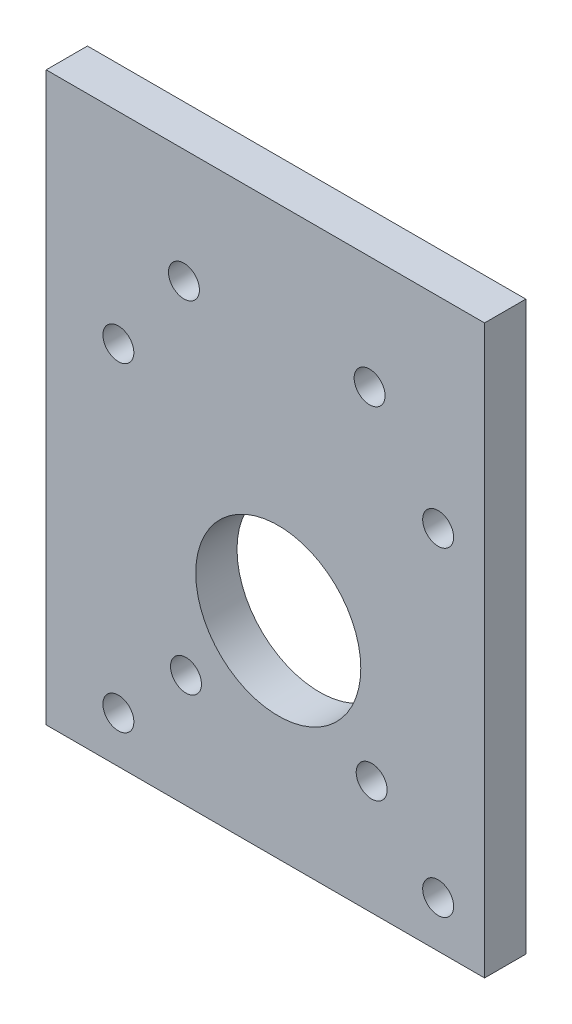
ISO-10303-21;
HEADER;
FILE_DESCRIPTION(('STEP AP214'),'2;1');
FILE_NAME('part.step','',(''),(''),'','','');
FILE_SCHEMA(('AUTOMOTIVE_DESIGN { 1 0 10303 214 1 1 1 1 }'));
ENDSEC;
DATA;
#1=APPLICATION_CONTEXT('core data for automotive mechanical design processes');
#2=APPLICATION_PROTOCOL_DEFINITION('international standard','automotive_design',2000,#1);
#3=PRODUCT_CONTEXT('',#1,'mechanical');
#4=PRODUCT('Part','Part','',(#3));
#5=PRODUCT_RELATED_PRODUCT_CATEGORY('part','',(#4));
#6=PRODUCT_DEFINITION_FORMATION('','',#4);
#7=PRODUCT_DEFINITION_CONTEXT('part definition',#1,'design');
#8=PRODUCT_DEFINITION('design','',#6,#7);
#9=PRODUCT_DEFINITION_SHAPE('','',#8);
#10=(LENGTH_UNIT() NAMED_UNIT(*) SI_UNIT(.MILLI.,.METRE.));
#11=(NAMED_UNIT(*) PLANE_ANGLE_UNIT() SI_UNIT($,.RADIAN.));
#12=(NAMED_UNIT(*) SI_UNIT($,.STERADIAN.) SOLID_ANGLE_UNIT());
#13=UNCERTAINTY_MEASURE_WITH_UNIT(LENGTH_MEASURE(1.E-05),#10,'distance_accuracy_value','');
#14=(GEOMETRIC_REPRESENTATION_CONTEXT(3) GLOBAL_UNCERTAINTY_ASSIGNED_CONTEXT((#13)) GLOBAL_UNIT_ASSIGNED_CONTEXT((#10,
#11,#12)) REPRESENTATION_CONTEXT('',''));
#15=CARTESIAN_POINT('',(0.,0.,0.));
#16=DIRECTION('',(0.,0.,1.));
#17=DIRECTION('',(1.,0.,0.));
#18=AXIS2_PLACEMENT_3D('',#15,#16,#17);
#19=CARTESIAN_POINT('',(21.25,20.,-2.));
#20=DIRECTION('',(-1.,0.,0.));
#21=DIRECTION('',(0.,0.,-1.));
#22=AXIS2_PLACEMENT_3D('',#19,#20,#21);
#23=PLANE('',#22);
#24=DIRECTION('',(0.,1.,0.));
#25=VECTOR('',#24,1.);
#26=CARTESIAN_POINT('',(21.25,20.,2.));
#27=LINE('',#26,#25);
#28=CARTESIAN_POINT('',(21.25,-20.,2.));
#29=VERTEX_POINT('',#28);
#30=CARTESIAN_POINT('',(21.25,35.,2.));
#31=VERTEX_POINT('',#30);
#32=EDGE_CURVE('E137',#29,#31,#27,.T.);
#33=ORIENTED_EDGE('',*,*,#32,.F.);
#34=DIRECTION('',(0.,0.,1.));
#35=VECTOR('',#34,1.);
#36=CARTESIAN_POINT('',(21.25,-20.,-2.));
#37=LINE('',#36,#35);
#38=CARTESIAN_POINT('',(21.25,-20.,-2.));
#39=VERTEX_POINT('',#38);
#40=EDGE_CURVE('E46',#39,#29,#37,.T.);
#41=ORIENTED_EDGE('',*,*,#40,.F.);
#42=DIRECTION('',(0.,1.,0.));
#43=VECTOR('',#42,1.);
#44=CARTESIAN_POINT('',(21.25,20.,-2.));
#45=LINE('',#44,#43);
#46=CARTESIAN_POINT('',(21.25,35.,-2.));
#47=VERTEX_POINT('',#46);
#48=EDGE_CURVE('E96',#39,#47,#45,.T.);
#49=ORIENTED_EDGE('',*,*,#48,.T.);
#50=DIRECTION('',(0.,0.,1.));
#51=VECTOR('',#50,1.);
#52=CARTESIAN_POINT('',(21.25,35.,2.));
#53=LINE('',#52,#51);
#54=EDGE_CURVE('E88',#47,#31,#53,.T.);
#55=ORIENTED_EDGE('',*,*,#54,.T.);
#56=EDGE_LOOP('',(#33,#41,#49,#55));
#57=FACE_BOUND('',#56,.T.);
#58=ADVANCED_FACE('F37',(#57),#23,.F.);
#59=CARTESIAN_POINT('',(-21.25,20.,-2.));
#60=DIRECTION('',(1.,0.,0.));
#61=DIRECTION('',(0.,1.,0.));
#62=AXIS2_PLACEMENT_3D('',#59,#60,#61);
#63=PLANE('',#62);
#64=DIRECTION('',(0.,-1.,0.));
#65=VECTOR('',#64,1.);
#66=CARTESIAN_POINT('',(-21.25,20.,2.));
#67=LINE('',#66,#65);
#68=CARTESIAN_POINT('',(-21.25,35.,2.));
#69=VERTEX_POINT('',#68);
#70=CARTESIAN_POINT('',(-21.25,-20.,2.));
#71=VERTEX_POINT('',#70);
#72=EDGE_CURVE('E99',#69,#71,#67,.T.);
#73=ORIENTED_EDGE('',*,*,#72,.F.);
#74=DIRECTION('',(0.,0.,-1.));
#75=VECTOR('',#74,1.);
#76=CARTESIAN_POINT('',(-21.25,35.,2.));
#77=LINE('',#76,#75);
#78=CARTESIAN_POINT('',(-21.25,35.,-2.));
#79=VERTEX_POINT('',#78);
#80=EDGE_CURVE('E85',#69,#79,#77,.T.);
#81=ORIENTED_EDGE('',*,*,#80,.T.);
#82=DIRECTION('',(0.,-1.,0.));
#83=VECTOR('',#82,1.);
#84=CARTESIAN_POINT('',(-21.25,20.,-2.));
#85=LINE('',#84,#83);
#86=CARTESIAN_POINT('',(-21.25,-20.,-2.));
#87=VERTEX_POINT('',#86);
#88=EDGE_CURVE('E93',#79,#87,#85,.T.);
#89=ORIENTED_EDGE('',*,*,#88,.T.);
#90=DIRECTION('',(0.,0.,1.));
#91=VECTOR('',#90,1.);
#92=CARTESIAN_POINT('',(-21.25,-20.,-2.));
#93=LINE('',#92,#91);
#94=EDGE_CURVE('E11',#87,#71,#93,.T.);
#95=ORIENTED_EDGE('',*,*,#94,.T.);
#96=EDGE_LOOP('',(#73,#81,#89,#95));
#97=FACE_BOUND('',#96,.T.);
#98=ADVANCED_FACE('F98',(#97),#63,.F.);
#99=CARTESIAN_POINT('',(-21.25,-20.,-2.));
#100=DIRECTION('',(0.,1.,0.));
#101=DIRECTION('',(0.,0.,-1.));
#102=AXIS2_PLACEMENT_3D('',#99,#100,#101);
#103=PLANE('',#102);
#104=DIRECTION('',(1.,0.,0.));
#105=VECTOR('',#104,1.);
#106=CARTESIAN_POINT('',(-21.25,-20.,2.));
#107=LINE('',#106,#105);
#108=EDGE_CURVE('E63',#71,#29,#107,.T.);
#109=ORIENTED_EDGE('',*,*,#108,.F.);
#110=ORIENTED_EDGE('',*,*,#94,.F.);
#111=DIRECTION('',(1.,0.,0.));
#112=VECTOR('',#111,1.);
#113=CARTESIAN_POINT('',(-21.25,-20.,-2.));
#114=LINE('',#113,#112);
#115=EDGE_CURVE('E55',#87,#39,#114,.T.);
#116=ORIENTED_EDGE('',*,*,#115,.T.);
#117=ORIENTED_EDGE('',*,*,#40,.T.);
#118=EDGE_LOOP('',(#109,#110,#116,#117));
#119=FACE_BOUND('',#118,.T.);
#120=ADVANCED_FACE('F178',(#119),#103,.F.);
#121=CARTESIAN_POINT('',(0.,0.,-2.));
#122=DIRECTION('',(0.,0.,-1.));
#123=DIRECTION('',(1.,0.,0.));
#124=AXIS2_PLACEMENT_3D('',#121,#122,#123);
#125=PLANE('',#124);
#126=CARTESIAN_POINT('',(-7.69577181131252,-9.05390339576949,-2.));
#127=DIRECTION('',(0.,0.,1.));
#128=DIRECTION('',(1.,0.,0.));
#129=AXIS2_PLACEMENT_3D('',#126,#127,#128);
#130=CIRCLE('',#129,1.5);
#131=CARTESIAN_POINT('',(-6.19577181131252,-9.05390339576949,-2.));
#132=VERTEX_POINT('',#131);
#133=EDGE_CURVE('E316',#132,#132,#130,.T.);
#134=ORIENTED_EDGE('',*,*,#133,.T.);
#135=EDGE_LOOP('',(#134));
#136=FACE_BOUND('',#135,.T.);
#137=CARTESIAN_POINT('',(10.3039033957695,-8.94577181131251,-2.));
#138=DIRECTION('',(0.,0.,1.));
#139=DIRECTION('',(1.,0.,0.));
#140=AXIS2_PLACEMENT_3D('',#137,#138,#139);
#141=CIRCLE('',#140,1.5);
#142=CARTESIAN_POINT('',(11.8039033957695,-8.94577181131251,-2.));
#143=VERTEX_POINT('',#142);
#144=EDGE_CURVE('E318',#143,#143,#141,.T.);
#145=ORIENTED_EDGE('',*,*,#144,.T.);
#146=EDGE_LOOP('',(#145));
#147=FACE_BOUND('',#146,.T.);
#148=CARTESIAN_POINT('',(10.1056621575984,24.0536327350045,-2.));
#149=DIRECTION('',(0.,0.,1.));
#150=DIRECTION('',(1.,0.,0.));
#151=AXIS2_PLACEMENT_3D('',#148,#149,#150);
#152=CIRCLE('',#151,1.5);
#153=CARTESIAN_POINT('',(11.6056621575984,24.0536327350045,-2.));
#154=VERTEX_POINT('',#153);
#155=EDGE_CURVE('E320',#154,#154,#152,.T.);
#156=ORIENTED_EDGE('',*,*,#155,.T.);
#157=EDGE_LOOP('',(#156));
#158=FACE_BOUND('',#157,.T.);
#159=CARTESIAN_POINT('',(-7.89401304948366,23.9455011505475,-2.));
#160=DIRECTION('',(0.,0.,1.));
#161=DIRECTION('',(1.,0.,0.));
#162=AXIS2_PLACEMENT_3D('',#159,#160,#161);
#163=CIRCLE('',#162,1.5);
#164=CARTESIAN_POINT('',(-6.39401304948366,23.9455011505475,-2.));
#165=VERTEX_POINT('',#164);
#166=EDGE_CURVE('E104',#165,#165,#163,.T.);
#167=ORIENTED_EDGE('',*,*,#166,.T.);
#168=EDGE_LOOP('',(#167));
#169=FACE_BOUND('',#168,.T.);
#170=CARTESIAN_POINT('',(1.25,0.,-2.));
#171=DIRECTION('',(0.,0.,1.));
#172=DIRECTION('',(1.,0.,0.));
#173=AXIS2_PLACEMENT_3D('',#170,#171,#172);
#174=CIRCLE('',#173,8.);
#175=CARTESIAN_POINT('',(9.25,0.,-2.));
#176=VERTEX_POINT('',#175);
#177=EDGE_CURVE('E109',#176,#176,#174,.T.);
#178=ORIENTED_EDGE('',*,*,#177,.T.);
#179=EDGE_LOOP('',(#178));
#180=FACE_BOUND('',#179,.T.);
#181=CARTESIAN_POINT('',(16.75,-15.5,-2.));
#182=DIRECTION('',(0.,0.,-1.));
#183=DIRECTION('',(-1.,0.,0.));
#184=AXIS2_PLACEMENT_3D('',#181,#182,#183);
#185=CIRCLE('',#184,1.5);
#186=CARTESIAN_POINT('',(15.25,-15.5,-2.));
#187=VERTEX_POINT('',#186);
#188=EDGE_CURVE('E129',#187,#187,#185,.T.);
#189=ORIENTED_EDGE('',*,*,#188,.F.);
#190=EDGE_LOOP('',(#189));
#191=FACE_BOUND('',#190,.T.);
#192=CARTESIAN_POINT('',(-14.25,-15.5,-2.));
#193=DIRECTION('',(0.,0.,-1.));
#194=DIRECTION('',(-1.,0.,0.));
#195=AXIS2_PLACEMENT_3D('',#192,#193,#194);
#196=CIRCLE('',#195,1.5);
#197=CARTESIAN_POINT('',(-15.75,-15.5,-2.));
#198=VERTEX_POINT('',#197);
#199=EDGE_CURVE('E123',#198,#198,#196,.T.);
#200=ORIENTED_EDGE('',*,*,#199,.F.);
#201=EDGE_LOOP('',(#200));
#202=FACE_BOUND('',#201,.T.);
#203=CARTESIAN_POINT('',(-14.25,15.5,-2.));
#204=DIRECTION('',(0.,0.,-1.));
#205=DIRECTION('',(-1.,0.,0.));
#206=AXIS2_PLACEMENT_3D('',#203,#204,#205);
#207=CIRCLE('',#206,1.5);
#208=CARTESIAN_POINT('',(-15.75,15.5,-2.));
#209=VERTEX_POINT('',#208);
#210=EDGE_CURVE('E116',#209,#209,#207,.T.);
#211=ORIENTED_EDGE('',*,*,#210,.F.);
#212=EDGE_LOOP('',(#211));
#213=FACE_BOUND('',#212,.T.);
#214=CARTESIAN_POINT('',(16.75,15.5,-2.));
#215=DIRECTION('',(0.,0.,-1.));
#216=DIRECTION('',(-1.,0.,0.));
#217=AXIS2_PLACEMENT_3D('',#214,#215,#216);
#218=CIRCLE('',#217,1.5);
#219=CARTESIAN_POINT('',(15.25,15.5,-2.));
#220=VERTEX_POINT('',#219);
#221=EDGE_CURVE('E134',#220,#220,#218,.T.);
#222=ORIENTED_EDGE('',*,*,#221,.F.);
#223=EDGE_LOOP('',(#222));
#224=FACE_BOUND('',#223,.T.);
#225=ORIENTED_EDGE('',*,*,#48,.F.);
#226=ORIENTED_EDGE('',*,*,#115,.F.);
#227=ORIENTED_EDGE('',*,*,#88,.F.);
#228=DIRECTION('',(1.,0.,0.));
#229=VECTOR('',#228,1.);
#230=CARTESIAN_POINT('',(-21.25,35.,-2.));
#231=LINE('',#230,#229);
#232=EDGE_CURVE('E81',#79,#47,#231,.T.);
#233=ORIENTED_EDGE('',*,*,#232,.T.);
#234=EDGE_LOOP('',(#225,#226,#227,#233));
#235=FACE_BOUND('',#234,.T.);
#236=ADVANCED_FACE('F94',(#136,#147,#158,#169,#180,#191,#202,#213,#224,#235),#125,.T.);
#237=CARTESIAN_POINT('',(0.,0.,2.));
#238=DIRECTION('',(0.,0.,-1.));
#239=DIRECTION('',(1.,0.,0.));
#240=AXIS2_PLACEMENT_3D('',#237,#238,#239);
#241=PLANE('',#240);
#242=CARTESIAN_POINT('',(-7.69577181131252,-9.05390339576949,2.));
#243=DIRECTION('',(0.,0.,1.));
#244=DIRECTION('',(1.,0.,0.));
#245=AXIS2_PLACEMENT_3D('',#242,#243,#244);
#246=CIRCLE('',#245,1.5);
#247=CARTESIAN_POINT('',(-6.19577181131252,-9.05390339576949,2.));
#248=VERTEX_POINT('',#247);
#249=EDGE_CURVE('E40',#248,#248,#246,.T.);
#250=ORIENTED_EDGE('',*,*,#249,.F.);
#251=EDGE_LOOP('',(#250));
#252=FACE_BOUND('',#251,.T.);
#253=CARTESIAN_POINT('',(10.3039033957695,-8.94577181131251,2.));
#254=DIRECTION('',(0.,0.,1.));
#255=DIRECTION('',(1.,0.,0.));
#256=AXIS2_PLACEMENT_3D('',#253,#254,#255);
#257=CIRCLE('',#256,1.5);
#258=CARTESIAN_POINT('',(11.8039033957695,-8.94577181131251,2.));
#259=VERTEX_POINT('',#258);
#260=EDGE_CURVE('E102',#259,#259,#257,.T.);
#261=ORIENTED_EDGE('',*,*,#260,.F.);
#262=EDGE_LOOP('',(#261));
#263=FACE_BOUND('',#262,.T.);
#264=CARTESIAN_POINT('',(10.1056621575984,24.0536327350045,2.));
#265=DIRECTION('',(0.,0.,1.));
#266=DIRECTION('',(1.,0.,0.));
#267=AXIS2_PLACEMENT_3D('',#264,#265,#266);
#268=CIRCLE('',#267,1.5);
#269=CARTESIAN_POINT('',(11.6056621575984,24.0536327350045,2.));
#270=VERTEX_POINT('',#269);
#271=EDGE_CURVE('E149',#270,#270,#268,.T.);
#272=ORIENTED_EDGE('',*,*,#271,.F.);
#273=EDGE_LOOP('',(#272));
#274=FACE_BOUND('',#273,.T.);
#275=CARTESIAN_POINT('',(-7.89401304948366,23.9455011505475,2.));
#276=DIRECTION('',(0.,0.,1.));
#277=DIRECTION('',(1.,0.,0.));
#278=AXIS2_PLACEMENT_3D('',#275,#276,#277);
#279=CIRCLE('',#278,1.5);
#280=CARTESIAN_POINT('',(-6.39401304948366,23.9455011505475,2.));
#281=VERTEX_POINT('',#280);
#282=EDGE_CURVE('E146',#281,#281,#279,.T.);
#283=ORIENTED_EDGE('',*,*,#282,.F.);
#284=EDGE_LOOP('',(#283));
#285=FACE_BOUND('',#284,.T.);
#286=CARTESIAN_POINT('',(1.25,0.,2.));
#287=DIRECTION('',(0.,0.,1.));
#288=DIRECTION('',(1.,0.,0.));
#289=AXIS2_PLACEMENT_3D('',#286,#287,#288);
#290=CIRCLE('',#289,8.);
#291=CARTESIAN_POINT('',(9.25,0.,2.));
#292=VERTEX_POINT('',#291);
#293=EDGE_CURVE('E110',#292,#292,#290,.T.);
#294=ORIENTED_EDGE('',*,*,#293,.F.);
#295=EDGE_LOOP('',(#294));
#296=FACE_BOUND('',#295,.T.);
#297=CARTESIAN_POINT('',(16.75,-15.5,2.));
#298=DIRECTION('',(0.,0.,-1.));
#299=DIRECTION('',(-1.,0.,0.));
#300=AXIS2_PLACEMENT_3D('',#297,#298,#299);
#301=CIRCLE('',#300,1.5);
#302=CARTESIAN_POINT('',(15.25,-15.5,2.));
#303=VERTEX_POINT('',#302);
#304=EDGE_CURVE('E113',#303,#303,#301,.T.);
#305=ORIENTED_EDGE('',*,*,#304,.T.);
#306=EDGE_LOOP('',(#305));
#307=FACE_BOUND('',#306,.T.);
#308=CARTESIAN_POINT('',(-14.25,-15.5,2.));
#309=DIRECTION('',(0.,0.,-1.));
#310=DIRECTION('',(-1.,0.,0.));
#311=AXIS2_PLACEMENT_3D('',#308,#309,#310);
#312=CIRCLE('',#311,1.5);
#313=CARTESIAN_POINT('',(-15.75,-15.5,2.));
#314=VERTEX_POINT('',#313);
#315=EDGE_CURVE('E126',#314,#314,#312,.T.);
#316=ORIENTED_EDGE('',*,*,#315,.T.);
#317=EDGE_LOOP('',(#316));
#318=FACE_BOUND('',#317,.T.);
#319=CARTESIAN_POINT('',(-14.25,15.5,2.));
#320=DIRECTION('',(0.,0.,-1.));
#321=DIRECTION('',(-1.,0.,0.));
#322=AXIS2_PLACEMENT_3D('',#319,#320,#321);
#323=CIRCLE('',#322,1.5);
#324=CARTESIAN_POINT('',(-15.75,15.5,2.));
#325=VERTEX_POINT('',#324);
#326=EDGE_CURVE('E120',#325,#325,#323,.T.);
#327=ORIENTED_EDGE('',*,*,#326,.T.);
#328=EDGE_LOOP('',(#327));
#329=FACE_BOUND('',#328,.T.);
#330=CARTESIAN_POINT('',(16.75,15.5,2.));
#331=DIRECTION('',(0.,0.,-1.));
#332=DIRECTION('',(-1.,0.,0.));
#333=AXIS2_PLACEMENT_3D('',#330,#331,#332);
#334=CIRCLE('',#333,1.5);
#335=CARTESIAN_POINT('',(15.25,15.5,2.));
#336=VERTEX_POINT('',#335);
#337=EDGE_CURVE('E119',#336,#336,#334,.T.);
#338=ORIENTED_EDGE('',*,*,#337,.T.);
#339=EDGE_LOOP('',(#338));
#340=FACE_BOUND('',#339,.T.);
#341=ORIENTED_EDGE('',*,*,#32,.T.);
#342=DIRECTION('',(-1.,0.,0.));
#343=VECTOR('',#342,1.);
#344=CARTESIAN_POINT('',(-21.25,35.,2.));
#345=LINE('',#344,#343);
#346=EDGE_CURVE('E70',#31,#69,#345,.T.);
#347=ORIENTED_EDGE('',*,*,#346,.T.);
#348=ORIENTED_EDGE('',*,*,#72,.T.);
#349=ORIENTED_EDGE('',*,*,#108,.T.);
#350=EDGE_LOOP('',(#341,#347,#348,#349));
#351=FACE_BOUND('',#350,.T.);
#352=ADVANCED_FACE('F156',(#252,#263,#274,#285,#296,#307,#318,#329,#340,#351),#241,.F.);
#353=CARTESIAN_POINT('',(16.75,15.5,-2.));
#354=DIRECTION('',(0.,0.,1.));
#355=DIRECTION('',(-1.,0.,0.));
#356=AXIS2_PLACEMENT_3D('',#353,#354,#355);
#357=CYLINDRICAL_SURFACE('',#356,1.5);
#358=ORIENTED_EDGE('',*,*,#221,.T.);
#359=EDGE_LOOP('',(#358));
#360=FACE_BOUND('',#359,.T.);
#361=ORIENTED_EDGE('',*,*,#337,.F.);
#362=EDGE_LOOP('',(#361));
#363=FACE_BOUND('',#362,.T.);
#364=ADVANCED_FACE('F159',(#360,#363),#357,.F.);
#365=CARTESIAN_POINT('',(-14.25,15.5,-2.));
#366=DIRECTION('',(0.,0.,1.));
#367=DIRECTION('',(-1.,0.,0.));
#368=AXIS2_PLACEMENT_3D('',#365,#366,#367);
#369=CYLINDRICAL_SURFACE('',#368,1.5);
#370=ORIENTED_EDGE('',*,*,#210,.T.);
#371=EDGE_LOOP('',(#370));
#372=FACE_BOUND('',#371,.T.);
#373=ORIENTED_EDGE('',*,*,#326,.F.);
#374=EDGE_LOOP('',(#373));
#375=FACE_BOUND('',#374,.T.);
#376=ADVANCED_FACE('F222',(#372,#375),#369,.F.);
#377=CARTESIAN_POINT('',(-14.25,-15.5,-2.));
#378=DIRECTION('',(0.,0.,1.));
#379=DIRECTION('',(-1.,0.,0.));
#380=AXIS2_PLACEMENT_3D('',#377,#378,#379);
#381=CYLINDRICAL_SURFACE('',#380,1.5);
#382=ORIENTED_EDGE('',*,*,#199,.T.);
#383=EDGE_LOOP('',(#382));
#384=FACE_BOUND('',#383,.T.);
#385=ORIENTED_EDGE('',*,*,#315,.F.);
#386=EDGE_LOOP('',(#385));
#387=FACE_BOUND('',#386,.T.);
#388=ADVANCED_FACE('F232',(#384,#387),#381,.F.);
#389=CARTESIAN_POINT('',(16.75,-15.5,-2.));
#390=DIRECTION('',(0.,0.,1.));
#391=DIRECTION('',(-1.,0.,0.));
#392=AXIS2_PLACEMENT_3D('',#389,#390,#391);
#393=CYLINDRICAL_SURFACE('',#392,1.5);
#394=ORIENTED_EDGE('',*,*,#188,.T.);
#395=EDGE_LOOP('',(#394));
#396=FACE_BOUND('',#395,.T.);
#397=ORIENTED_EDGE('',*,*,#304,.F.);
#398=EDGE_LOOP('',(#397));
#399=FACE_BOUND('',#398,.T.);
#400=ADVANCED_FACE('F242',(#396,#399),#393,.F.);
#401=CARTESIAN_POINT('',(1.25,0.,2.));
#402=DIRECTION('',(0.,0.,-1.));
#403=DIRECTION('',(1.,0.,0.));
#404=AXIS2_PLACEMENT_3D('',#401,#402,#403);
#405=CYLINDRICAL_SURFACE('',#404,8.);
#406=ORIENTED_EDGE('',*,*,#293,.T.);
#407=EDGE_LOOP('',(#406));
#408=FACE_BOUND('',#407,.T.);
#409=ORIENTED_EDGE('',*,*,#177,.F.);
#410=EDGE_LOOP('',(#409));
#411=FACE_BOUND('',#410,.T.);
#412=ADVANCED_FACE('F252',(#408,#411),#405,.F.);
#413=CARTESIAN_POINT('',(0.,35.,0.));
#414=DIRECTION('',(0.,1.,0.));
#415=DIRECTION('',(0.,0.,-1.));
#416=AXIS2_PLACEMENT_3D('',#413,#414,#415);
#417=PLANE('',#416);
#418=ORIENTED_EDGE('',*,*,#80,.F.);
#419=ORIENTED_EDGE('',*,*,#346,.F.);
#420=ORIENTED_EDGE('',*,*,#54,.F.);
#421=ORIENTED_EDGE('',*,*,#232,.F.);
#422=EDGE_LOOP('',(#418,#419,#420,#421));
#423=FACE_BOUND('',#422,.T.);
#424=ADVANCED_FACE('F83',(#423),#417,.T.);
#425=CARTESIAN_POINT('',(-7.89401304948366,23.9455011505475,8.));
#426=DIRECTION('',(0.,0.,-1.));
#427=DIRECTION('',(1.,0.,0.));
#428=AXIS2_PLACEMENT_3D('',#425,#426,#427);
#429=CYLINDRICAL_SURFACE('',#428,1.5);
#430=ORIENTED_EDGE('',*,*,#166,.F.);
#431=EDGE_LOOP('',(#430));
#432=FACE_BOUND('',#431,.T.);
#433=ORIENTED_EDGE('',*,*,#282,.T.);
#434=EDGE_LOOP('',(#433));
#435=FACE_BOUND('',#434,.T.);
#436=ADVANCED_FACE('F271',(#432,#435),#429,.F.);
#437=CARTESIAN_POINT('',(10.1056621575984,24.0536327350045,8.));
#438=DIRECTION('',(0.,0.,-1.));
#439=DIRECTION('',(1.,0.,0.));
#440=AXIS2_PLACEMENT_3D('',#437,#438,#439);
#441=CYLINDRICAL_SURFACE('',#440,1.5);
#442=ORIENTED_EDGE('',*,*,#155,.F.);
#443=EDGE_LOOP('',(#442));
#444=FACE_BOUND('',#443,.T.);
#445=ORIENTED_EDGE('',*,*,#271,.T.);
#446=EDGE_LOOP('',(#445));
#447=FACE_BOUND('',#446,.T.);
#448=ADVANCED_FACE('F280',(#444,#447),#441,.F.);
#449=CARTESIAN_POINT('',(10.3039033957695,-8.94577181131251,8.));
#450=DIRECTION('',(0.,0.,-1.));
#451=DIRECTION('',(1.,0.,0.));
#452=AXIS2_PLACEMENT_3D('',#449,#450,#451);
#453=CYLINDRICAL_SURFACE('',#452,1.5);
#454=ORIENTED_EDGE('',*,*,#144,.F.);
#455=EDGE_LOOP('',(#454));
#456=FACE_BOUND('',#455,.T.);
#457=ORIENTED_EDGE('',*,*,#260,.T.);
#458=EDGE_LOOP('',(#457));
#459=FACE_BOUND('',#458,.T.);
#460=ADVANCED_FACE('F154',(#456,#459),#453,.F.);
#461=CARTESIAN_POINT('',(-7.69577181131252,-9.05390339576949,8.));
#462=DIRECTION('',(0.,0.,-1.));
#463=DIRECTION('',(1.,0.,0.));
#464=AXIS2_PLACEMENT_3D('',#461,#462,#463);
#465=CYLINDRICAL_SURFACE('',#464,1.5);
#466=ORIENTED_EDGE('',*,*,#133,.F.);
#467=EDGE_LOOP('',(#466));
#468=FACE_BOUND('',#467,.T.);
#469=ORIENTED_EDGE('',*,*,#249,.T.);
#470=EDGE_LOOP('',(#469));
#471=FACE_BOUND('',#470,.T.);
#472=ADVANCED_FACE('F299',(#468,#471),#465,.F.);
#473=CLOSED_SHELL('',(#58,#98,#120,#236,#352,#364,#376,#388,#400,#412,#424,#436,#448,#460,#472));
#474=MANIFOLD_SOLID_BREP('B2',#473);
#475=ADVANCED_BREP_SHAPE_REPRESENTATION('',(#18,#474),#14);
#476=SHAPE_DEFINITION_REPRESENTATION(#9,#475);
ENDSEC;
END-ISO-10303-21;
